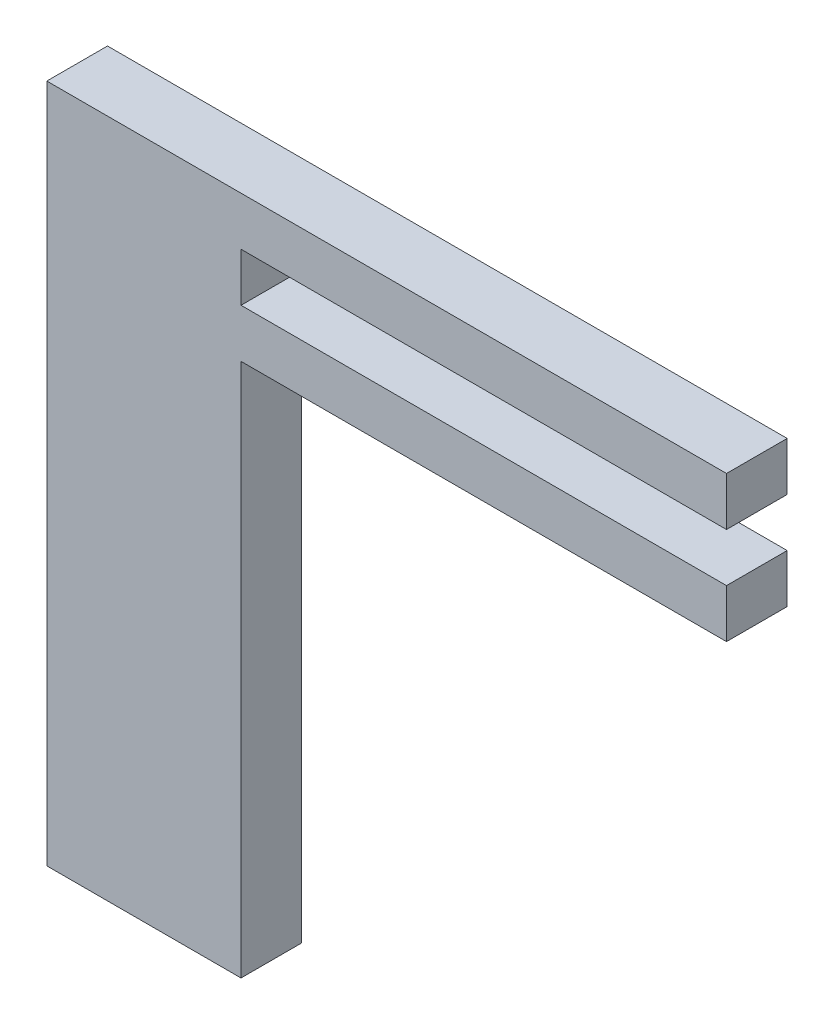
ISO-10303-21;
HEADER;
FILE_DESCRIPTION(('STEP AP214'),'2;1');
FILE_NAME('part.step','',(''),(''),'','','');
FILE_SCHEMA(('AUTOMOTIVE_DESIGN { 1 0 10303 214 1 1 1 1 }'));
ENDSEC;
DATA;
#1=APPLICATION_CONTEXT('core data for automotive mechanical design processes');
#2=APPLICATION_PROTOCOL_DEFINITION('international standard','automotive_design',2000,#1);
#3=PRODUCT_CONTEXT('',#1,'mechanical');
#4=PRODUCT('Part','Part','',(#3));
#5=PRODUCT_RELATED_PRODUCT_CATEGORY('part','',(#4));
#6=PRODUCT_DEFINITION_FORMATION('','',#4);
#7=PRODUCT_DEFINITION_CONTEXT('part definition',#1,'design');
#8=PRODUCT_DEFINITION('design','',#6,#7);
#9=PRODUCT_DEFINITION_SHAPE('','',#8);
#10=(LENGTH_UNIT() NAMED_UNIT(*) SI_UNIT(.MILLI.,.METRE.));
#11=(NAMED_UNIT(*) PLANE_ANGLE_UNIT() SI_UNIT($,.RADIAN.));
#12=(NAMED_UNIT(*) SI_UNIT($,.STERADIAN.) SOLID_ANGLE_UNIT());
#13=UNCERTAINTY_MEASURE_WITH_UNIT(LENGTH_MEASURE(1.E-05),#10,'distance_accuracy_value','');
#14=(GEOMETRIC_REPRESENTATION_CONTEXT(3) GLOBAL_UNCERTAINTY_ASSIGNED_CONTEXT((#13)) GLOBAL_UNIT_ASSIGNED_CONTEXT((#10,
#11,#12)) REPRESENTATION_CONTEXT('',''));
#15=CARTESIAN_POINT('',(0.,0.,0.));
#16=DIRECTION('',(0.,0.,1.));
#17=DIRECTION('',(1.,0.,0.));
#18=AXIS2_PLACEMENT_3D('',#15,#16,#17);
#19=CARTESIAN_POINT('',(4.,14.,2.5));
#20=DIRECTION('',(-1.,0.,0.));
#21=DIRECTION('',(0.,-1.,0.));
#22=AXIS2_PLACEMENT_3D('',#19,#20,#21);
#23=PLANE('',#22);
#24=DIRECTION('',(0.,0.,-1.));
#25=VECTOR('',#24,1.);
#26=CARTESIAN_POINT('',(4.,8.,2.5));
#27=LINE('',#26,#25);
#28=CARTESIAN_POINT('',(4.,8.,2.5));
#29=VERTEX_POINT('',#28);
#30=CARTESIAN_POINT('',(4.,8.,0.));
#31=VERTEX_POINT('',#30);
#32=EDGE_CURVE('E62',#29,#31,#27,.T.);
#33=ORIENTED_EDGE('',*,*,#32,.F.);
#34=DIRECTION('',(0.,1.,0.));
#35=VECTOR('',#34,1.);
#36=CARTESIAN_POINT('',(4.,14.,2.5));
#37=LINE('',#36,#35);
#38=CARTESIAN_POINT('',(4.,-14.,2.5));
#39=VERTEX_POINT('',#38);
#40=EDGE_CURVE('E166',#39,#29,#37,.T.);
#41=ORIENTED_EDGE('',*,*,#40,.F.);
#42=DIRECTION('',(0.,0.,-1.));
#43=VECTOR('',#42,1.);
#44=CARTESIAN_POINT('',(4.,-14.,2.5));
#45=LINE('',#44,#43);
#46=CARTESIAN_POINT('',(4.,-14.,0.));
#47=VERTEX_POINT('',#46);
#48=EDGE_CURVE('E257',#39,#47,#45,.T.);
#49=ORIENTED_EDGE('',*,*,#48,.T.);
#50=DIRECTION('',(0.,1.,0.));
#51=VECTOR('',#50,1.);
#52=CARTESIAN_POINT('',(4.,14.,0.));
#53=LINE('',#52,#51);
#54=EDGE_CURVE('E258',#47,#31,#53,.T.);
#55=ORIENTED_EDGE('',*,*,#54,.T.);
#56=EDGE_LOOP('',(#33,#41,#49,#55));
#57=FACE_BOUND('',#56,.T.);
#58=ADVANCED_FACE('F39',(#57),#23,.F.);
#59=DIRECTION('',(0.,0.,1.));
#60=VECTOR('',#59,1.);
#61=CARTESIAN_POINT('',(4.,10.,2.5));
#62=LINE('',#61,#60);
#63=CARTESIAN_POINT('',(4.,10.,0.));
#64=VERTEX_POINT('',#63);
#65=CARTESIAN_POINT('',(4.,10.,2.5));
#66=VERTEX_POINT('',#65);
#67=EDGE_CURVE('E163',#64,#66,#62,.T.);
#68=ORIENTED_EDGE('',*,*,#67,.F.);
#69=CARTESIAN_POINT('',(4.,12.,0.));
#70=VERTEX_POINT('',#69);
#71=EDGE_CURVE('E236',#64,#70,#53,.T.);
#72=ORIENTED_EDGE('',*,*,#71,.T.);
#73=DIRECTION('',(0.,0.,-1.));
#74=VECTOR('',#73,1.);
#75=CARTESIAN_POINT('',(4.,12.,2.5));
#76=LINE('',#75,#74);
#77=CARTESIAN_POINT('',(4.,12.,2.5));
#78=VERTEX_POINT('',#77);
#79=EDGE_CURVE('E168',#78,#70,#76,.T.);
#80=ORIENTED_EDGE('',*,*,#79,.F.);
#81=EDGE_CURVE('E54',#66,#78,#37,.T.);
#82=ORIENTED_EDGE('',*,*,#81,.F.);
#83=EDGE_LOOP('',(#68,#72,#80,#82));
#84=FACE_BOUND('',#83,.T.);
#85=ADVANCED_FACE('F303',(#84),#23,.F.);
#86=CARTESIAN_POINT('',(-4.,14.,2.5));
#87=DIRECTION('',(0.,-1.,0.));
#88=DIRECTION('',(0.,0.,-1.));
#89=AXIS2_PLACEMENT_3D('',#86,#87,#88);
#90=PLANE('',#89);
#91=DIRECTION('',(-1.,0.,0.));
#92=VECTOR('',#91,1.);
#93=CARTESIAN_POINT('',(-4.,14.,0.));
#94=LINE('',#93,#92);
#95=CARTESIAN_POINT('',(24.,14.,0.));
#96=VERTEX_POINT('',#95);
#97=CARTESIAN_POINT('',(-4.,14.,0.));
#98=VERTEX_POINT('',#97);
#99=EDGE_CURVE('E261',#96,#98,#94,.T.);
#100=ORIENTED_EDGE('',*,*,#99,.T.);
#101=DIRECTION('',(0.,0.,-1.));
#102=VECTOR('',#101,1.);
#103=CARTESIAN_POINT('',(-4.,14.,2.5));
#104=LINE('',#103,#102);
#105=CARTESIAN_POINT('',(-4.,14.,2.5));
#106=VERTEX_POINT('',#105);
#107=EDGE_CURVE('E11',#106,#98,#104,.T.);
#108=ORIENTED_EDGE('',*,*,#107,.F.);
#109=DIRECTION('',(-1.,0.,0.));
#110=VECTOR('',#109,1.);
#111=CARTESIAN_POINT('',(-4.,14.,2.5));
#112=LINE('',#111,#110);
#113=CARTESIAN_POINT('',(24.,14.,2.5));
#114=VERTEX_POINT('',#113);
#115=EDGE_CURVE('E248',#114,#106,#112,.T.);
#116=ORIENTED_EDGE('',*,*,#115,.F.);
#117=DIRECTION('',(0.,0.,1.));
#118=VECTOR('',#117,1.);
#119=CARTESIAN_POINT('',(24.,14.,2.5));
#120=LINE('',#119,#118);
#121=EDGE_CURVE('E189',#96,#114,#120,.T.);
#122=ORIENTED_EDGE('',*,*,#121,.F.);
#123=EDGE_LOOP('',(#100,#108,#116,#122));
#124=FACE_BOUND('',#123,.T.);
#125=ADVANCED_FACE('F305',(#124),#90,.F.);
#126=CARTESIAN_POINT('',(-4.,14.,2.5));
#127=DIRECTION('',(1.,0.,0.));
#128=DIRECTION('',(0.,1.,0.));
#129=AXIS2_PLACEMENT_3D('',#126,#127,#128);
#130=PLANE('',#129);
#131=DIRECTION('',(0.,-1.,0.));
#132=VECTOR('',#131,1.);
#133=CARTESIAN_POINT('',(-4.,14.,0.));
#134=LINE('',#133,#132);
#135=CARTESIAN_POINT('',(-4.,-14.,0.));
#136=VERTEX_POINT('',#135);
#137=EDGE_CURVE('E264',#98,#136,#134,.T.);
#138=ORIENTED_EDGE('',*,*,#137,.T.);
#139=DIRECTION('',(0.,0.,-1.));
#140=VECTOR('',#139,1.);
#141=CARTESIAN_POINT('',(-4.,-14.,2.5));
#142=LINE('',#141,#140);
#143=CARTESIAN_POINT('',(-4.,-14.,2.5));
#144=VERTEX_POINT('',#143);
#145=EDGE_CURVE('E47',#144,#136,#142,.T.);
#146=ORIENTED_EDGE('',*,*,#145,.F.);
#147=DIRECTION('',(0.,-1.,0.));
#148=VECTOR('',#147,1.);
#149=CARTESIAN_POINT('',(-4.,14.,2.5));
#150=LINE('',#149,#148);
#151=EDGE_CURVE('E251',#106,#144,#150,.T.);
#152=ORIENTED_EDGE('',*,*,#151,.F.);
#153=ORIENTED_EDGE('',*,*,#107,.T.);
#154=EDGE_LOOP('',(#138,#146,#152,#153));
#155=FACE_BOUND('',#154,.T.);
#156=ADVANCED_FACE('F310',(#155),#130,.F.);
#157=CARTESIAN_POINT('',(-4.,-14.,2.5));
#158=DIRECTION('',(0.,1.,0.));
#159=DIRECTION('',(0.,0.,1.));
#160=AXIS2_PLACEMENT_3D('',#157,#158,#159);
#161=PLANE('',#160);
#162=DIRECTION('',(-1.,0.,0.));
#163=VECTOR('',#162,1.);
#164=CARTESIAN_POINT('',(-1.5,-14.,1.55));
#165=LINE('',#164,#163);
#166=CARTESIAN_POINT('',(1.5,-14.,1.55));
#167=VERTEX_POINT('',#166);
#168=CARTESIAN_POINT('',(-1.5,-14.,1.55));
#169=VERTEX_POINT('',#168);
#170=EDGE_CURVE('E222',#167,#169,#165,.T.);
#171=ORIENTED_EDGE('',*,*,#170,.F.);
#172=DIRECTION('',(0.,0.,1.));
#173=VECTOR('',#172,1.);
#174=CARTESIAN_POINT('',(1.5,-14.,1.55));
#175=LINE('',#174,#173);
#176=CARTESIAN_POINT('',(1.5,-14.,0.950000000000001));
#177=VERTEX_POINT('',#176);
#178=EDGE_CURVE('E201',#177,#167,#175,.T.);
#179=ORIENTED_EDGE('',*,*,#178,.F.);
#180=DIRECTION('',(1.,0.,0.));
#181=VECTOR('',#180,1.);
#182=CARTESIAN_POINT('',(-1.5,-14.,0.950000000000001));
#183=LINE('',#182,#181);
#184=CARTESIAN_POINT('',(-1.5,-14.,0.950000000000001));
#185=VERTEX_POINT('',#184);
#186=EDGE_CURVE('E207',#185,#177,#183,.T.);
#187=ORIENTED_EDGE('',*,*,#186,.F.);
#188=DIRECTION('',(0.,0.,-1.));
#189=VECTOR('',#188,1.);
#190=CARTESIAN_POINT('',(-1.5,-14.,1.55));
#191=LINE('',#190,#189);
#192=EDGE_CURVE('E226',#169,#185,#191,.T.);
#193=ORIENTED_EDGE('',*,*,#192,.F.);
#194=EDGE_LOOP('',(#171,#179,#187,#193));
#195=FACE_BOUND('',#194,.T.);
#196=DIRECTION('',(1.,0.,0.));
#197=VECTOR('',#196,1.);
#198=CARTESIAN_POINT('',(-4.,-14.,0.));
#199=LINE('',#198,#197);
#200=EDGE_CURVE('E267',#136,#47,#199,.T.);
#201=ORIENTED_EDGE('',*,*,#200,.T.);
#202=ORIENTED_EDGE('',*,*,#48,.F.);
#203=DIRECTION('',(1.,0.,0.));
#204=VECTOR('',#203,1.);
#205=CARTESIAN_POINT('',(-4.,-14.,2.5));
#206=LINE('',#205,#204);
#207=EDGE_CURVE('E254',#144,#39,#206,.T.);
#208=ORIENTED_EDGE('',*,*,#207,.F.);
#209=ORIENTED_EDGE('',*,*,#145,.T.);
#210=EDGE_LOOP('',(#201,#202,#208,#209));
#211=FACE_BOUND('',#210,.T.);
#212=ADVANCED_FACE('F278',(#195,#211),#161,.F.);
#213=CARTESIAN_POINT('',(0.,0.,2.5));
#214=DIRECTION('',(0.,0.,1.));
#215=DIRECTION('',(1.,0.,0.));
#216=AXIS2_PLACEMENT_3D('',#213,#214,#215);
#217=PLANE('',#216);
#218=ORIENTED_EDGE('',*,*,#40,.T.);
#219=DIRECTION('',(-1.,0.,0.));
#220=VECTOR('',#219,1.);
#221=CARTESIAN_POINT('',(24.,8.00000000000001,2.5));
#222=LINE('',#221,#220);
#223=CARTESIAN_POINT('',(24.,8.00000000000001,2.5));
#224=VERTEX_POINT('',#223);
#225=EDGE_CURVE('E146',#224,#29,#222,.T.);
#226=ORIENTED_EDGE('',*,*,#225,.F.);
#227=DIRECTION('',(0.,-1.,0.));
#228=VECTOR('',#227,1.);
#229=CARTESIAN_POINT('',(24.,10.,2.5));
#230=LINE('',#229,#228);
#231=CARTESIAN_POINT('',(24.,10.,2.5));
#232=VERTEX_POINT('',#231);
#233=EDGE_CURVE('E153',#232,#224,#230,.T.);
#234=ORIENTED_EDGE('',*,*,#233,.F.);
#235=DIRECTION('',(-1.,0.,0.));
#236=VECTOR('',#235,1.);
#237=CARTESIAN_POINT('',(24.,10.,2.5));
#238=LINE('',#237,#236);
#239=EDGE_CURVE('E293',#232,#66,#238,.T.);
#240=ORIENTED_EDGE('',*,*,#239,.T.);
#241=ORIENTED_EDGE('',*,*,#81,.T.);
#242=DIRECTION('',(-1.,0.,0.));
#243=VECTOR('',#242,1.);
#244=CARTESIAN_POINT('',(24.,12.,2.5));
#245=LINE('',#244,#243);
#246=CARTESIAN_POINT('',(24.,12.,2.5));
#247=VERTEX_POINT('',#246);
#248=EDGE_CURVE('E197',#247,#78,#245,.T.);
#249=ORIENTED_EDGE('',*,*,#248,.F.);
#250=DIRECTION('',(0.,-1.,0.));
#251=VECTOR('',#250,1.);
#252=CARTESIAN_POINT('',(24.,14.,2.5));
#253=LINE('',#252,#251);
#254=EDGE_CURVE('E173',#114,#247,#253,.T.);
#255=ORIENTED_EDGE('',*,*,#254,.F.);
#256=ORIENTED_EDGE('',*,*,#115,.T.);
#257=ORIENTED_EDGE('',*,*,#151,.T.);
#258=ORIENTED_EDGE('',*,*,#207,.T.);
#259=EDGE_LOOP('',(#218,#226,#234,#240,#241,#249,#255,#256,#257,#258));
#260=FACE_BOUND('',#259,.T.);
#261=ADVANCED_FACE('F165',(#260),#217,.T.);
#262=CARTESIAN_POINT('',(0.,0.,0.));
#263=DIRECTION('',(0.,0.,1.));
#264=DIRECTION('',(1.,0.,0.));
#265=AXIS2_PLACEMENT_3D('',#262,#263,#264);
#266=PLANE('',#265);
#267=ORIENTED_EDGE('',*,*,#54,.F.);
#268=ORIENTED_EDGE('',*,*,#200,.F.);
#269=ORIENTED_EDGE('',*,*,#137,.F.);
#270=ORIENTED_EDGE('',*,*,#99,.F.);
#271=DIRECTION('',(0.,1.,0.));
#272=VECTOR('',#271,1.);
#273=CARTESIAN_POINT('',(24.,14.,0.));
#274=LINE('',#273,#272);
#275=CARTESIAN_POINT('',(24.,12.,0.));
#276=VERTEX_POINT('',#275);
#277=EDGE_CURVE('E185',#276,#96,#274,.T.);
#278=ORIENTED_EDGE('',*,*,#277,.F.);
#279=DIRECTION('',(-1.,0.,0.));
#280=VECTOR('',#279,1.);
#281=CARTESIAN_POINT('',(24.,12.,0.));
#282=LINE('',#281,#280);
#283=EDGE_CURVE('E192',#276,#70,#282,.T.);
#284=ORIENTED_EDGE('',*,*,#283,.T.);
#285=ORIENTED_EDGE('',*,*,#71,.F.);
#286=DIRECTION('',(-1.,0.,0.));
#287=VECTOR('',#286,1.);
#288=CARTESIAN_POINT('',(24.,10.,0.));
#289=LINE('',#288,#287);
#290=CARTESIAN_POINT('',(24.,10.,0.));
#291=VERTEX_POINT('',#290);
#292=EDGE_CURVE('E175',#291,#64,#289,.T.);
#293=ORIENTED_EDGE('',*,*,#292,.F.);
#294=DIRECTION('',(0.,1.,0.));
#295=VECTOR('',#294,1.);
#296=CARTESIAN_POINT('',(24.,10.,0.));
#297=LINE('',#296,#295);
#298=CARTESIAN_POINT('',(24.,8.,0.));
#299=VERTEX_POINT('',#298);
#300=EDGE_CURVE('E152',#299,#291,#297,.T.);
#301=ORIENTED_EDGE('',*,*,#300,.F.);
#302=DIRECTION('',(-1.,0.,0.));
#303=VECTOR('',#302,1.);
#304=CARTESIAN_POINT('',(24.,8.,0.));
#305=LINE('',#304,#303);
#306=EDGE_CURVE('E148',#299,#31,#305,.T.);
#307=ORIENTED_EDGE('',*,*,#306,.T.);
#308=EDGE_LOOP('',(#267,#268,#269,#270,#278,#284,#285,#293,#301,#307));
#309=FACE_BOUND('',#308,.T.);
#310=ADVANCED_FACE('F285',(#309),#266,.F.);
#311=CARTESIAN_POINT('',(1.5,11.,1.55));
#312=DIRECTION('',(1.,0.,0.));
#313=DIRECTION('',(0.,0.,-1.));
#314=AXIS2_PLACEMENT_3D('',#311,#312,#313);
#315=PLANE('',#314);
#316=ORIENTED_EDGE('',*,*,#178,.T.);
#317=DIRECTION('',(0.,-1.,0.));
#318=VECTOR('',#317,1.);
#319=CARTESIAN_POINT('',(1.5,11.,1.55));
#320=LINE('',#319,#318);
#321=CARTESIAN_POINT('',(1.5,11.,1.55));
#322=VERTEX_POINT('',#321);
#323=EDGE_CURVE('E219',#322,#167,#320,.T.);
#324=ORIENTED_EDGE('',*,*,#323,.F.);
#325=DIRECTION('',(0.,0.,1.));
#326=VECTOR('',#325,1.);
#327=CARTESIAN_POINT('',(1.5,11.,1.55));
#328=LINE('',#327,#326);
#329=CARTESIAN_POINT('',(1.5,11.,0.950000000000001));
#330=VERTEX_POINT('',#329);
#331=EDGE_CURVE('E202',#330,#322,#328,.T.);
#332=ORIENTED_EDGE('',*,*,#331,.F.);
#333=DIRECTION('',(0.,-1.,0.));
#334=VECTOR('',#333,1.);
#335=CARTESIAN_POINT('',(1.5,11.,0.950000000000001));
#336=LINE('',#335,#334);
#337=EDGE_CURVE('E233',#330,#177,#336,.T.);
#338=ORIENTED_EDGE('',*,*,#337,.T.);
#339=EDGE_LOOP('',(#316,#324,#332,#338));
#340=FACE_BOUND('',#339,.T.);
#341=ADVANCED_FACE('F352',(#340),#315,.F.);
#342=CARTESIAN_POINT('',(-1.5,11.,0.950000000000001));
#343=DIRECTION('',(0.,0.,-1.));
#344=DIRECTION('',(-1.,0.,0.));
#345=AXIS2_PLACEMENT_3D('',#342,#343,#344);
#346=PLANE('',#345);
#347=ORIENTED_EDGE('',*,*,#186,.T.);
#348=ORIENTED_EDGE('',*,*,#337,.F.);
#349=DIRECTION('',(1.,0.,0.));
#350=VECTOR('',#349,1.);
#351=CARTESIAN_POINT('',(-1.5,11.,0.950000000000001));
#352=LINE('',#351,#350);
#353=CARTESIAN_POINT('',(-1.5,11.,0.950000000000001));
#354=VERTEX_POINT('',#353);
#355=EDGE_CURVE('E215',#354,#330,#352,.T.);
#356=ORIENTED_EDGE('',*,*,#355,.F.);
#357=DIRECTION('',(0.,-1.,0.));
#358=VECTOR('',#357,1.);
#359=CARTESIAN_POINT('',(-1.5,11.,0.950000000000001));
#360=LINE('',#359,#358);
#361=EDGE_CURVE('E237',#354,#185,#360,.T.);
#362=ORIENTED_EDGE('',*,*,#361,.T.);
#363=EDGE_LOOP('',(#347,#348,#356,#362));
#364=FACE_BOUND('',#363,.T.);
#365=ADVANCED_FACE('F405',(#364),#346,.F.);
#366=CARTESIAN_POINT('',(-1.5,11.,1.55));
#367=DIRECTION('',(-1.,0.,0.));
#368=DIRECTION('',(0.,0.,1.));
#369=AXIS2_PLACEMENT_3D('',#366,#367,#368);
#370=PLANE('',#369);
#371=ORIENTED_EDGE('',*,*,#192,.T.);
#372=ORIENTED_EDGE('',*,*,#361,.F.);
#373=DIRECTION('',(0.,0.,-1.));
#374=VECTOR('',#373,1.);
#375=CARTESIAN_POINT('',(-1.5,11.,1.55));
#376=LINE('',#375,#374);
#377=CARTESIAN_POINT('',(-1.5,11.,1.55));
#378=VERTEX_POINT('',#377);
#379=EDGE_CURVE('E211',#378,#354,#376,.T.);
#380=ORIENTED_EDGE('',*,*,#379,.F.);
#381=DIRECTION('',(0.,-1.,0.));
#382=VECTOR('',#381,1.);
#383=CARTESIAN_POINT('',(-1.5,11.,1.55));
#384=LINE('',#383,#382);
#385=EDGE_CURVE('E240',#378,#169,#384,.T.);
#386=ORIENTED_EDGE('',*,*,#385,.T.);
#387=EDGE_LOOP('',(#371,#372,#380,#386));
#388=FACE_BOUND('',#387,.T.);
#389=ADVANCED_FACE('F408',(#388),#370,.F.);
#390=CARTESIAN_POINT('',(-1.5,11.,1.55));
#391=DIRECTION('',(0.,0.,1.));
#392=DIRECTION('',(1.,0.,0.));
#393=AXIS2_PLACEMENT_3D('',#390,#391,#392);
#394=PLANE('',#393);
#395=ORIENTED_EDGE('',*,*,#170,.T.);
#396=ORIENTED_EDGE('',*,*,#385,.F.);
#397=DIRECTION('',(-1.,0.,0.));
#398=VECTOR('',#397,1.);
#399=CARTESIAN_POINT('',(-1.5,11.,1.55));
#400=LINE('',#399,#398);
#401=EDGE_CURVE('E206',#322,#378,#400,.T.);
#402=ORIENTED_EDGE('',*,*,#401,.F.);
#403=ORIENTED_EDGE('',*,*,#323,.T.);
#404=EDGE_LOOP('',(#395,#396,#402,#403));
#405=FACE_BOUND('',#404,.T.);
#406=ADVANCED_FACE('F403',(#405),#394,.F.);
#407=CARTESIAN_POINT('',(0.,11.,0.));
#408=DIRECTION('',(0.,-1.,0.));
#409=DIRECTION('',(0.,0.,-1.));
#410=AXIS2_PLACEMENT_3D('',#407,#408,#409);
#411=PLANE('',#410);
#412=ORIENTED_EDGE('',*,*,#331,.T.);
#413=ORIENTED_EDGE('',*,*,#401,.T.);
#414=ORIENTED_EDGE('',*,*,#379,.T.);
#415=ORIENTED_EDGE('',*,*,#355,.T.);
#416=EDGE_LOOP('',(#412,#413,#414,#415));
#417=FACE_BOUND('',#416,.T.);
#418=ADVANCED_FACE('F321',(#417),#411,.T.);
#419=CARTESIAN_POINT('',(24.,12.,2.5));
#420=DIRECTION('',(0.,1.,0.));
#421=DIRECTION('',(0.,0.,1.));
#422=AXIS2_PLACEMENT_3D('',#419,#420,#421);
#423=PLANE('',#422);
#424=ORIENTED_EDGE('',*,*,#79,.T.);
#425=ORIENTED_EDGE('',*,*,#283,.F.);
#426=DIRECTION('',(0.,0.,-1.));
#427=VECTOR('',#426,1.);
#428=CARTESIAN_POINT('',(24.,12.,2.5));
#429=LINE('',#428,#427);
#430=EDGE_CURVE('E182',#247,#276,#429,.T.);
#431=ORIENTED_EDGE('',*,*,#430,.F.);
#432=ORIENTED_EDGE('',*,*,#248,.T.);
#433=EDGE_LOOP('',(#424,#425,#431,#432));
#434=FACE_BOUND('',#433,.T.);
#435=ADVANCED_FACE('F359',(#434),#423,.F.);
#436=CARTESIAN_POINT('',(24.,0.,0.));
#437=DIRECTION('',(1.,0.,0.));
#438=DIRECTION('',(0.,0.,-1.));
#439=AXIS2_PLACEMENT_3D('',#436,#437,#438);
#440=PLANE('',#439);
#441=ORIENTED_EDGE('',*,*,#254,.T.);
#442=ORIENTED_EDGE('',*,*,#430,.T.);
#443=ORIENTED_EDGE('',*,*,#277,.T.);
#444=ORIENTED_EDGE('',*,*,#121,.T.);
#445=EDGE_LOOP('',(#441,#442,#443,#444));
#446=FACE_BOUND('',#445,.T.);
#447=ADVANCED_FACE('F363',(#446),#440,.T.);
#448=CARTESIAN_POINT('',(24.,8.00000000000001,2.5));
#449=DIRECTION('',(0.,1.,0.));
#450=DIRECTION('',(0.,0.,1.));
#451=AXIS2_PLACEMENT_3D('',#448,#449,#450);
#452=PLANE('',#451);
#453=ORIENTED_EDGE('',*,*,#32,.T.);
#454=ORIENTED_EDGE('',*,*,#306,.F.);
#455=DIRECTION('',(0.,0.,-1.));
#456=VECTOR('',#455,1.);
#457=CARTESIAN_POINT('',(24.,8.00000000000001,2.5));
#458=LINE('',#457,#456);
#459=EDGE_CURVE('E142',#224,#299,#458,.T.);
#460=ORIENTED_EDGE('',*,*,#459,.F.);
#461=ORIENTED_EDGE('',*,*,#225,.T.);
#462=EDGE_LOOP('',(#453,#454,#460,#461));
#463=FACE_BOUND('',#462,.T.);
#464=ADVANCED_FACE('F144',(#463),#452,.F.);
#465=CARTESIAN_POINT('',(24.,10.,2.5));
#466=DIRECTION('',(0.,-1.,0.));
#467=DIRECTION('',(1.,0.,0.));
#468=AXIS2_PLACEMENT_3D('',#465,#466,#467);
#469=PLANE('',#468);
#470=ORIENTED_EDGE('',*,*,#67,.T.);
#471=ORIENTED_EDGE('',*,*,#239,.F.);
#472=DIRECTION('',(0.,0.,1.));
#473=VECTOR('',#472,1.);
#474=CARTESIAN_POINT('',(24.,10.,2.5));
#475=LINE('',#474,#473);
#476=EDGE_CURVE('E158',#291,#232,#475,.T.);
#477=ORIENTED_EDGE('',*,*,#476,.F.);
#478=ORIENTED_EDGE('',*,*,#292,.T.);
#479=EDGE_LOOP('',(#470,#471,#477,#478));
#480=FACE_BOUND('',#479,.T.);
#481=ADVANCED_FACE('F299',(#480),#469,.F.);
#482=CARTESIAN_POINT('',(24.,0.,0.));
#483=DIRECTION('',(1.,0.,0.));
#484=DIRECTION('',(0.,0.,-1.));
#485=AXIS2_PLACEMENT_3D('',#482,#483,#484);
#486=PLANE('',#485);
#487=ORIENTED_EDGE('',*,*,#233,.T.);
#488=ORIENTED_EDGE('',*,*,#459,.T.);
#489=ORIENTED_EDGE('',*,*,#300,.T.);
#490=ORIENTED_EDGE('',*,*,#476,.T.);
#491=EDGE_LOOP('',(#487,#488,#489,#490));
#492=FACE_BOUND('',#491,.T.);
#493=ADVANCED_FACE('F156',(#492),#486,.T.);
#494=CLOSED_SHELL('',(#58,#85,#125,#156,#212,#261,#310,#341,#365,#389,#406,#418,#435,#447,#464,
#481,#493));
#495=MANIFOLD_SOLID_BREP('B2',#494);
#496=ADVANCED_BREP_SHAPE_REPRESENTATION('',(#18,#495),#14);
#497=SHAPE_DEFINITION_REPRESENTATION(#9,#496);
ENDSEC;
END-ISO-10303-21;
